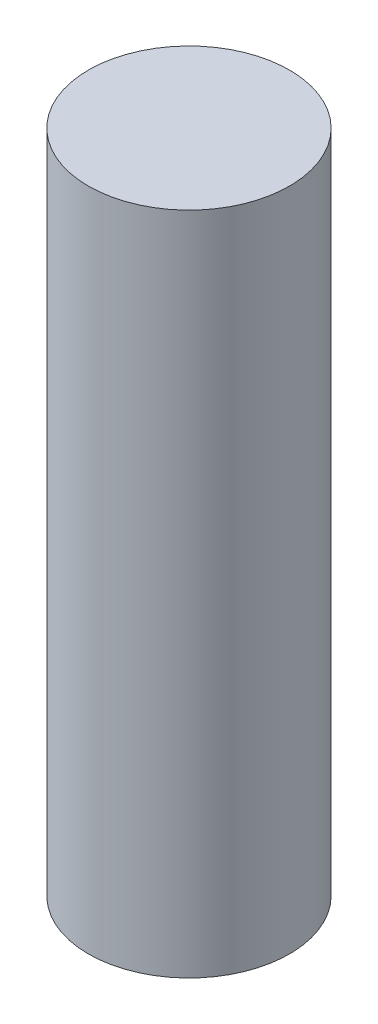
ISO-10303-21;
HEADER;
FILE_DESCRIPTION(('STEP AP214'),'2;1');
FILE_NAME('part.step','',(''),(''),'','','');
FILE_SCHEMA(('AUTOMOTIVE_DESIGN { 1 0 10303 214 1 1 1 1 }'));
ENDSEC;
DATA;
#1=APPLICATION_CONTEXT('core data for automotive mechanical design processes');
#2=APPLICATION_PROTOCOL_DEFINITION('international standard','automotive_design',2000,#1);
#3=PRODUCT_CONTEXT('',#1,'mechanical');
#4=PRODUCT('Part','Part','',(#3));
#5=PRODUCT_RELATED_PRODUCT_CATEGORY('part','',(#4));
#6=PRODUCT_DEFINITION_FORMATION('','',#4);
#7=PRODUCT_DEFINITION_CONTEXT('part definition',#1,'design');
#8=PRODUCT_DEFINITION('design','',#6,#7);
#9=PRODUCT_DEFINITION_SHAPE('','',#8);
#10=(LENGTH_UNIT() NAMED_UNIT(*) SI_UNIT(.MILLI.,.METRE.));
#11=(NAMED_UNIT(*) PLANE_ANGLE_UNIT() SI_UNIT($,.RADIAN.));
#12=(NAMED_UNIT(*) SI_UNIT($,.STERADIAN.) SOLID_ANGLE_UNIT());
#13=UNCERTAINTY_MEASURE_WITH_UNIT(LENGTH_MEASURE(1.E-05),#10,'distance_accuracy_value','');
#14=(GEOMETRIC_REPRESENTATION_CONTEXT(3) GLOBAL_UNCERTAINTY_ASSIGNED_CONTEXT((#13)) GLOBAL_UNIT_ASSIGNED_CONTEXT((#10,
#11,#12)) REPRESENTATION_CONTEXT('',''));
#15=CARTESIAN_POINT('',(0.,0.,0.));
#16=DIRECTION('',(0.,0.,1.));
#17=DIRECTION('',(1.,0.,0.));
#18=AXIS2_PLACEMENT_3D('',#15,#16,#17);
#19=CARTESIAN_POINT('',(0.,15.,0.));
#20=DIRECTION('',(0.,-1.,0.));
#21=DIRECTION('',(0.,0.,-1.));
#22=AXIS2_PLACEMENT_3D('',#19,#20,#21);
#23=CYLINDRICAL_SURFACE('',#22,3.175);
#24=CARTESIAN_POINT('',(0.,0.,0.));
#25=DIRECTION('',(0.,1.,0.));
#26=DIRECTION('',(0.,0.,1.));
#27=AXIS2_PLACEMENT_3D('',#24,#25,#26);
#28=CIRCLE('',#27,3.175);
#29=CARTESIAN_POINT('',(-1.71026313764871,0.,-2.675));
#30=VERTEX_POINT('',#29);
#31=CARTESIAN_POINT('',(1.71026313764871,0.,-2.675));
#32=VERTEX_POINT('',#31);
#33=EDGE_CURVE('E74',#30,#32,#28,.T.);
#34=ORIENTED_EDGE('',*,*,#33,.T.);
#35=DIRECTION('',(0.,-1.,0.));
#36=VECTOR('',#35,1.);
#37=CARTESIAN_POINT('',(1.71026313764871,15.,-2.675));
#38=LINE('',#37,#36);
#39=CARTESIAN_POINT('',(1.71026313764871,15.,-2.675));
#40=VERTEX_POINT('',#39);
#41=EDGE_CURVE('E11',#40,#32,#38,.T.);
#42=ORIENTED_EDGE('',*,*,#41,.F.);
#43=CARTESIAN_POINT('',(0.,15.,0.));
#44=DIRECTION('',(0.,1.,0.));
#45=DIRECTION('',(0.,0.,1.));
#46=AXIS2_PLACEMENT_3D('',#43,#44,#45);
#47=CIRCLE('',#46,3.175);
#48=CARTESIAN_POINT('',(-1.71026313764871,15.,-2.675));
#49=VERTEX_POINT('',#48);
#50=EDGE_CURVE('E68',#40,#49,#47,.T.);
#51=ORIENTED_EDGE('',*,*,#50,.T.);
#52=DIRECTION('',(0.,-1.,0.));
#53=VECTOR('',#52,1.);
#54=CARTESIAN_POINT('',(-1.71026313764871,15.,-2.675));
#55=LINE('',#54,#53);
#56=EDGE_CURVE('E44',#49,#30,#55,.T.);
#57=ORIENTED_EDGE('',*,*,#56,.T.);
#58=EDGE_LOOP('',(#34,#42,#51,#57));
#59=FACE_BOUND('',#58,.T.);
#60=CARTESIAN_POINT('',(0.,21.,0.));
#61=DIRECTION('',(0.,1.,0.));
#62=DIRECTION('',(0.,0.,1.));
#63=AXIS2_PLACEMENT_3D('',#60,#61,#62);
#64=CIRCLE('',#63,3.175);
#65=CARTESIAN_POINT('',(0.,21.,3.175));
#66=VERTEX_POINT('',#65);
#67=EDGE_CURVE('E71',#66,#66,#64,.T.);
#68=ORIENTED_EDGE('',*,*,#67,.F.);
#69=EDGE_LOOP('',(#68));
#70=FACE_BOUND('',#69,.T.);
#71=ADVANCED_FACE('F36',(#59,#70),#23,.T.);
#72=CARTESIAN_POINT('',(-1.71026313764871,15.,-2.675));
#73=DIRECTION('',(0.,0.,1.));
#74=DIRECTION('',(1.,0.,0.));
#75=AXIS2_PLACEMENT_3D('',#72,#73,#74);
#76=PLANE('',#75);
#77=DIRECTION('',(-1.,0.,0.));
#78=VECTOR('',#77,1.);
#79=CARTESIAN_POINT('',(-1.71026313764871,0.,-2.675));
#80=LINE('',#79,#78);
#81=EDGE_CURVE('E59',#32,#30,#80,.T.);
#82=ORIENTED_EDGE('',*,*,#81,.T.);
#83=ORIENTED_EDGE('',*,*,#56,.F.);
#84=DIRECTION('',(-1.,0.,0.));
#85=VECTOR('',#84,1.);
#86=CARTESIAN_POINT('',(-1.71026313764871,15.,-2.675));
#87=LINE('',#86,#85);
#88=EDGE_CURVE('E50',#40,#49,#87,.T.);
#89=ORIENTED_EDGE('',*,*,#88,.F.);
#90=ORIENTED_EDGE('',*,*,#41,.T.);
#91=EDGE_LOOP('',(#82,#83,#89,#90));
#92=FACE_BOUND('',#91,.T.);
#93=ADVANCED_FACE('F61',(#92),#76,.F.);
#94=CARTESIAN_POINT('',(0.,0.,0.));
#95=DIRECTION('',(0.,1.,0.));
#96=DIRECTION('',(0.,0.,1.));
#97=AXIS2_PLACEMENT_3D('',#94,#95,#96);
#98=PLANE('',#97);
#99=ORIENTED_EDGE('',*,*,#33,.F.);
#100=ORIENTED_EDGE('',*,*,#81,.F.);
#101=EDGE_LOOP('',(#99,#100));
#102=FACE_BOUND('',#101,.T.);
#103=ADVANCED_FACE('F78',(#102),#98,.F.);
#104=CARTESIAN_POINT('',(0.,15.,0.));
#105=DIRECTION('',(0.,1.,0.));
#106=DIRECTION('',(0.,0.,1.));
#107=AXIS2_PLACEMENT_3D('',#104,#105,#106);
#108=PLANE('',#107);
#109=ORIENTED_EDGE('',*,*,#50,.F.);
#110=ORIENTED_EDGE('',*,*,#88,.T.);
#111=EDGE_LOOP('',(#109,#110));
#112=FACE_BOUND('',#111,.T.);
#113=ADVANCED_FACE('F67',(#112),#108,.F.);
#114=CARTESIAN_POINT('',(0.,21.,0.));
#115=DIRECTION('',(0.,1.,0.));
#116=DIRECTION('',(0.,0.,1.));
#117=AXIS2_PLACEMENT_3D('',#114,#115,#116);
#118=PLANE('',#117);
#119=ORIENTED_EDGE('',*,*,#67,.T.);
#120=EDGE_LOOP('',(#119));
#121=FACE_BOUND('',#120,.T.);
#122=ADVANCED_FACE('F85',(#121),#118,.T.);
#123=CLOSED_SHELL('',(#71,#93,#103,#113,#122));
#124=MANIFOLD_SOLID_BREP('B2',#123);
#125=ADVANCED_BREP_SHAPE_REPRESENTATION('',(#18,#124),#14);
#126=SHAPE_DEFINITION_REPRESENTATION(#9,#125);
ENDSEC;
END-ISO-10303-21;
